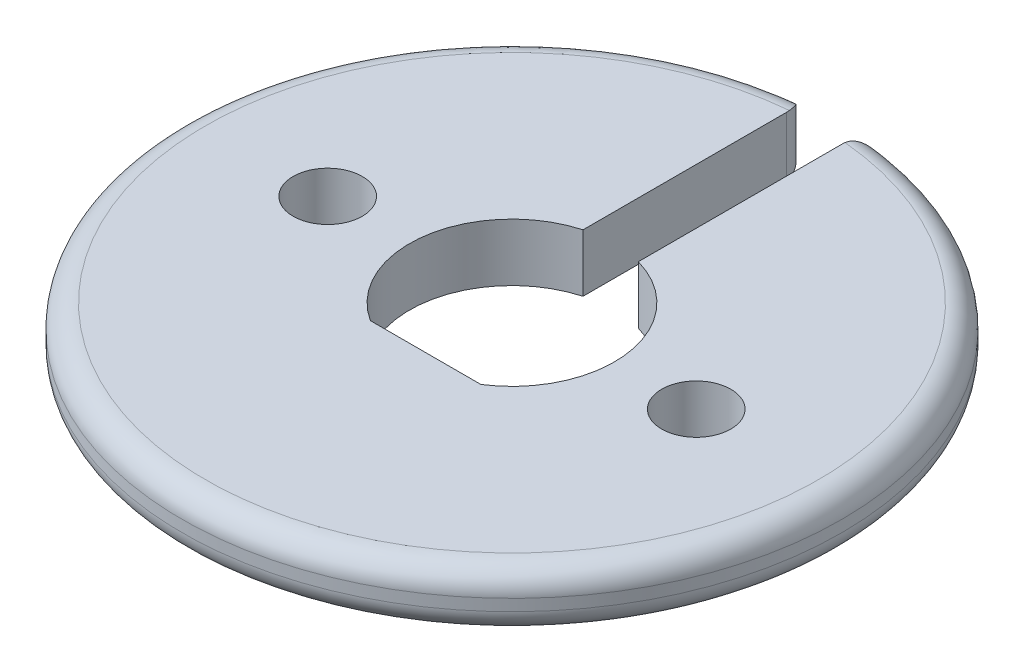
ISO-10303-21;
HEADER;
FILE_DESCRIPTION(('STEP AP214'),'2;1');
FILE_NAME('part.step','',(''),(''),'','','');
FILE_SCHEMA(('AUTOMOTIVE_DESIGN { 1 0 10303 214 1 1 1 1 }'));
ENDSEC;
DATA;
#1=APPLICATION_CONTEXT('core data for automotive mechanical design processes');
#2=APPLICATION_PROTOCOL_DEFINITION('international standard','automotive_design',2000,#1);
#3=PRODUCT_CONTEXT('',#1,'mechanical');
#4=PRODUCT('Part','Part','',(#3));
#5=PRODUCT_RELATED_PRODUCT_CATEGORY('part','',(#4));
#6=PRODUCT_DEFINITION_FORMATION('','',#4);
#7=PRODUCT_DEFINITION_CONTEXT('part definition',#1,'design');
#8=PRODUCT_DEFINITION('design','',#6,#7);
#9=PRODUCT_DEFINITION_SHAPE('','',#8);
#10=(LENGTH_UNIT() NAMED_UNIT(*) SI_UNIT(.MILLI.,.METRE.));
#11=(NAMED_UNIT(*) PLANE_ANGLE_UNIT() SI_UNIT($,.RADIAN.));
#12=(NAMED_UNIT(*) SI_UNIT($,.STERADIAN.) SOLID_ANGLE_UNIT());
#13=UNCERTAINTY_MEASURE_WITH_UNIT(LENGTH_MEASURE(1.E-05),#10,'distance_accuracy_value','');
#14=(GEOMETRIC_REPRESENTATION_CONTEXT(3) GLOBAL_UNCERTAINTY_ASSIGNED_CONTEXT((#13)) GLOBAL_UNIT_ASSIGNED_CONTEXT((#10,
#11,#12)) REPRESENTATION_CONTEXT('',''));
#15=CARTESIAN_POINT('',(0.,0.,0.));
#16=DIRECTION('',(0.,0.,1.));
#17=DIRECTION('',(1.,0.,0.));
#18=AXIS2_PLACEMENT_3D('',#15,#16,#17);
#19=CARTESIAN_POINT('',(0.,2.5,0.));
#20=DIRECTION('',(0.,-1.,0.));
#21=DIRECTION('',(0.,0.,-1.));
#22=AXIS2_PLACEMENT_3D('',#19,#20,#21);
#23=CYLINDRICAL_SURFACE('',#22,4.45);
#24=DIRECTION('',(0.,-1.,0.));
#25=VECTOR('',#24,1.);
#26=CARTESIAN_POINT('',(1.2,2.5,-4.28514877221317));
#27=LINE('',#26,#25);
#28=CARTESIAN_POINT('',(1.2,0.,-4.28514877221317));
#29=VERTEX_POINT('',#28);
#30=CARTESIAN_POINT('',(1.2,2.5,-4.28514877221317));
#31=VERTEX_POINT('',#30);
#32=EDGE_CURVE('E124',#29,#31,#27,.F.);
#33=ORIENTED_EDGE('',*,*,#32,.F.);
#34=CARTESIAN_POINT('',(0.,0.,0.));
#35=DIRECTION('',(0.,1.,0.));
#36=DIRECTION('',(0.,0.,1.));
#37=AXIS2_PLACEMENT_3D('',#34,#35,#36);
#38=CIRCLE('',#37,4.45);
#39=CARTESIAN_POINT('',(2.4,0.,3.74733238451035));
#40=VERTEX_POINT('',#39);
#41=EDGE_CURVE('E140',#40,#29,#38,.T.);
#42=ORIENTED_EDGE('',*,*,#41,.F.);
#43=DIRECTION('',(0.,-1.,0.));
#44=VECTOR('',#43,1.);
#45=CARTESIAN_POINT('',(2.4,2.5,3.74733238451035));
#46=LINE('',#45,#44);
#47=CARTESIAN_POINT('',(2.4,2.5,3.74733238451035));
#48=VERTEX_POINT('',#47);
#49=EDGE_CURVE('E153',#48,#40,#46,.T.);
#50=ORIENTED_EDGE('',*,*,#49,.F.);
#51=CARTESIAN_POINT('',(0.,2.5,0.));
#52=DIRECTION('',(0.,1.,0.));
#53=DIRECTION('',(0.,0.,1.));
#54=AXIS2_PLACEMENT_3D('',#51,#52,#53);
#55=CIRCLE('',#54,4.45);
#56=EDGE_CURVE('E229',#48,#31,#55,.T.);
#57=ORIENTED_EDGE('',*,*,#56,.T.);
#58=EDGE_LOOP('',(#33,#42,#50,#57));
#59=FACE_BOUND('',#58,.T.);
#60=ADVANCED_FACE('F38',(#59),#23,.F.);
#61=CARTESIAN_POINT('',(0.,2.5,0.));
#62=DIRECTION('',(0.,1.,0.));
#63=DIRECTION('',(0.,0.,1.));
#64=AXIS2_PLACEMENT_3D('',#61,#62,#63);
#65=PLANE('',#64);
#66=CARTESIAN_POINT('',(8.,2.5,2.82555433138731E-13));
#67=DIRECTION('',(0.,1.,0.));
#68=DIRECTION('',(0.,0.,1.));
#69=AXIS2_PLACEMENT_3D('',#66,#67,#68);
#70=CIRCLE('',#69,1.5);
#71=CARTESIAN_POINT('',(8.,2.5,1.50000000000028));
#72=VERTEX_POINT('',#71);
#73=EDGE_CURVE('E216',#72,#72,#70,.T.);
#74=ORIENTED_EDGE('',*,*,#73,.F.);
#75=EDGE_LOOP('',(#74));
#76=FACE_BOUND('',#75,.T.);
#77=CARTESIAN_POINT('',(-8.,2.5,2.86229373536173E-13));
#78=DIRECTION('',(0.,1.,0.));
#79=DIRECTION('',(0.,0.,1.));
#80=AXIS2_PLACEMENT_3D('',#77,#78,#79);
#81=CIRCLE('',#80,1.5);
#82=CARTESIAN_POINT('',(-8.,2.5,1.50000000000029));
#83=VERTEX_POINT('',#82);
#84=EDGE_CURVE('E221',#83,#83,#81,.T.);
#85=ORIENTED_EDGE('',*,*,#84,.F.);
#86=EDGE_LOOP('',(#85));
#87=FACE_BOUND('',#86,.T.);
#88=DIRECTION('',(0.,0.,1.));
#89=VECTOR('',#88,1.);
#90=CARTESIAN_POINT('',(-1.2,2.5,0.));
#91=LINE('',#90,#89);
#92=CARTESIAN_POINT('',(-1.2,2.5,-13.1245701078071));
#93=VERTEX_POINT('',#92);
#94=CARTESIAN_POINT('',(-1.2,2.5,-4.28514877221317));
#95=VERTEX_POINT('',#94);
#96=EDGE_CURVE('E120',#93,#95,#91,.T.);
#97=ORIENTED_EDGE('',*,*,#96,.F.);
#98=CARTESIAN_POINT('',(-2.2,2.5,-13.1245701078071));
#99=DIRECTION('',(0.,1.,0.));
#100=DIRECTION('',(0.,0.,1.));
#101=AXIS2_PLACEMENT_3D('',#98,#99,#100);
#102=CIRCLE('',#101,1.);
#103=CARTESIAN_POINT('',(-1.20824469118221,2.5,-13.2527161473026));
#104=VERTEX_POINT('',#103);
#105=EDGE_CURVE('E48',#93,#104,#102,.T.);
#106=ORIENTED_EDGE('',*,*,#105,.T.);
#107=CARTESIAN_POINT('',(0.,2.5,0.));
#108=DIRECTION('',(0.,1.,0.));
#109=DIRECTION('',(0.,0.,1.));
#110=AXIS2_PLACEMENT_3D('',#107,#108,#109);
#111=CIRCLE('',#110,13.3076797569954);
#112=CARTESIAN_POINT('',(1.20824469118221,2.5,-13.2527161473026));
#113=VERTEX_POINT('',#112);
#114=EDGE_CURVE('E59',#104,#113,#111,.T.);
#115=ORIENTED_EDGE('',*,*,#114,.T.);
#116=CARTESIAN_POINT('',(2.2,2.5,-13.1245701078071));
#117=DIRECTION('',(0.,1.,0.));
#118=DIRECTION('',(0.,0.,1.));
#119=AXIS2_PLACEMENT_3D('',#116,#117,#118);
#120=CIRCLE('',#119,1.);
#121=CARTESIAN_POINT('',(1.2,2.5,-13.1245701078071));
#122=VERTEX_POINT('',#121);
#123=EDGE_CURVE('E174',#113,#122,#120,.T.);
#124=ORIENTED_EDGE('',*,*,#123,.T.);
#125=DIRECTION('',(0.,0.,-1.));
#126=VECTOR('',#125,1.);
#127=CARTESIAN_POINT('',(1.2,2.5,0.));
#128=LINE('',#127,#126);
#129=EDGE_CURVE('E141',#31,#122,#128,.T.);
#130=ORIENTED_EDGE('',*,*,#129,.F.);
#131=ORIENTED_EDGE('',*,*,#56,.F.);
#132=DIRECTION('',(1.,0.,0.));
#133=VECTOR('',#132,1.);
#134=CARTESIAN_POINT('',(-2.4,2.5,3.74733238451035));
#135=LINE('',#134,#133);
#136=CARTESIAN_POINT('',(-2.4,2.5,3.74733238451035));
#137=VERTEX_POINT('',#136);
#138=EDGE_CURVE('E149',#137,#48,#135,.T.);
#139=ORIENTED_EDGE('',*,*,#138,.F.);
#140=EDGE_CURVE('E152',#95,#137,#55,.T.);
#141=ORIENTED_EDGE('',*,*,#140,.F.);
#142=EDGE_LOOP('',(#97,#106,#115,#124,#130,#131,#139,#141));
#143=FACE_BOUND('',#142,.T.);
#144=ADVANCED_FACE('F238',(#76,#87,#143),#65,.T.);
#145=CARTESIAN_POINT('',(0.,0.,0.));
#146=DIRECTION('',(0.,1.,0.));
#147=DIRECTION('',(0.,0.,1.));
#148=AXIS2_PLACEMENT_3D('',#145,#146,#147);
#149=PLANE('',#148);
#150=CARTESIAN_POINT('',(8.,0.,2.82555433138731E-13));
#151=DIRECTION('',(0.,1.,0.));
#152=DIRECTION('',(0.,0.,1.));
#153=AXIS2_PLACEMENT_3D('',#150,#151,#152);
#154=CIRCLE('',#153,1.5);
#155=CARTESIAN_POINT('',(8.,0.,1.50000000000028));
#156=VERTEX_POINT('',#155);
#157=EDGE_CURVE('E43',#156,#156,#154,.T.);
#158=ORIENTED_EDGE('',*,*,#157,.T.);
#159=EDGE_LOOP('',(#158));
#160=FACE_BOUND('',#159,.T.);
#161=CARTESIAN_POINT('',(-8.,0.,2.86229373536173E-13));
#162=DIRECTION('',(0.,1.,0.));
#163=DIRECTION('',(0.,0.,1.));
#164=AXIS2_PLACEMENT_3D('',#161,#162,#163);
#165=CIRCLE('',#164,1.5);
#166=CARTESIAN_POINT('',(-8.,0.,1.50000000000029));
#167=VERTEX_POINT('',#166);
#168=EDGE_CURVE('E214',#167,#167,#165,.T.);
#169=ORIENTED_EDGE('',*,*,#168,.T.);
#170=EDGE_LOOP('',(#169));
#171=FACE_BOUND('',#170,.T.);
#172=CARTESIAN_POINT('',(0.,0.,0.));
#173=DIRECTION('',(0.,1.,0.));
#174=DIRECTION('',(0.,0.,1.));
#175=AXIS2_PLACEMENT_3D('',#172,#173,#174);
#176=CIRCLE('',#175,13.3076797569954);
#177=CARTESIAN_POINT('',(1.20824469118221,0.,-13.2527161473026));
#178=VERTEX_POINT('',#177);
#179=CARTESIAN_POINT('',(-1.20824469118221,0.,-13.2527161473026));
#180=VERTEX_POINT('',#179);
#181=EDGE_CURVE('E167',#178,#180,#176,.F.);
#182=ORIENTED_EDGE('',*,*,#181,.T.);
#183=CARTESIAN_POINT('',(-2.2,0.,-13.1245701078071));
#184=DIRECTION('',(0.,1.,0.));
#185=DIRECTION('',(0.,0.,1.));
#186=AXIS2_PLACEMENT_3D('',#183,#184,#185);
#187=CIRCLE('',#186,1.);
#188=CARTESIAN_POINT('',(-1.2,0.,-13.1245701078071));
#189=VERTEX_POINT('',#188);
#190=EDGE_CURVE('E133',#180,#189,#187,.F.);
#191=ORIENTED_EDGE('',*,*,#190,.T.);
#192=DIRECTION('',(0.,0.,-1.));
#193=VECTOR('',#192,1.);
#194=CARTESIAN_POINT('',(-1.2,0.,-4.28514877221317));
#195=LINE('',#194,#193);
#196=CARTESIAN_POINT('',(-1.2,0.,-4.28514877221317));
#197=VERTEX_POINT('',#196);
#198=EDGE_CURVE('E118',#197,#189,#195,.T.);
#199=ORIENTED_EDGE('',*,*,#198,.F.);
#200=CARTESIAN_POINT('',(-2.4,0.,3.74733238451035));
#201=VERTEX_POINT('',#200);
#202=EDGE_CURVE('E130',#197,#201,#38,.T.);
#203=ORIENTED_EDGE('',*,*,#202,.T.);
#204=DIRECTION('',(1.,0.,0.));
#205=VECTOR('',#204,1.);
#206=CARTESIAN_POINT('',(-2.4,0.,3.74733238451035));
#207=LINE('',#206,#205);
#208=EDGE_CURVE('E144',#201,#40,#207,.T.);
#209=ORIENTED_EDGE('',*,*,#208,.T.);
#210=ORIENTED_EDGE('',*,*,#41,.T.);
#211=DIRECTION('',(0.,0.,1.));
#212=VECTOR('',#211,1.);
#213=CARTESIAN_POINT('',(1.2,0.,-4.28514877221317));
#214=LINE('',#213,#212);
#215=CARTESIAN_POINT('',(1.2,0.,-13.1245701078071));
#216=VERTEX_POINT('',#215);
#217=EDGE_CURVE('E134',#216,#29,#214,.T.);
#218=ORIENTED_EDGE('',*,*,#217,.F.);
#219=CARTESIAN_POINT('',(2.2,0.,-13.1245701078071));
#220=DIRECTION('',(0.,1.,0.));
#221=DIRECTION('',(0.,0.,1.));
#222=AXIS2_PLACEMENT_3D('',#219,#220,#221);
#223=CIRCLE('',#222,1.);
#224=EDGE_CURVE('E169',#216,#178,#223,.F.);
#225=ORIENTED_EDGE('',*,*,#224,.T.);
#226=EDGE_LOOP('',(#182,#191,#199,#203,#209,#210,#218,#225));
#227=FACE_BOUND('',#226,.T.);
#228=ADVANCED_FACE('F128',(#160,#171,#227),#149,.F.);
#229=CARTESIAN_POINT('',(0.,2.5,0.));
#230=DIRECTION('',(0.,-1.,0.));
#231=DIRECTION('',(0.,0.,-1.));
#232=AXIS2_PLACEMENT_3D('',#229,#230,#231);
#233=CYLINDRICAL_SURFACE('',#232,14.3076797569954);
#234=CARTESIAN_POINT('',(0.,1.5,0.));
#235=DIRECTION('',(0.,1.,0.));
#236=DIRECTION('',(0.,0.,1.));
#237=AXIS2_PLACEMENT_3D('',#234,#235,#236);
#238=CIRCLE('',#237,14.3076797569954);
#239=CARTESIAN_POINT('',(2.36531807498926,1.5,-14.1108104102091));
#240=VERTEX_POINT('',#239);
#241=CARTESIAN_POINT('',(-2.36531807498926,1.5,-14.1108104102091));
#242=VERTEX_POINT('',#241);
#243=EDGE_CURVE('E162',#240,#242,#238,.F.);
#244=ORIENTED_EDGE('',*,*,#243,.T.);
#245=DIRECTION('',(0.,-1.,0.));
#246=VECTOR('',#245,1.);
#247=CARTESIAN_POINT('',(-2.36531807498926,2.5,-14.1108104102091));
#248=LINE('',#247,#246);
#249=CARTESIAN_POINT('',(-2.36531807498926,1.,-14.1108104102091));
#250=VERTEX_POINT('',#249);
#251=EDGE_CURVE('E164',#242,#250,#248,.T.);
#252=ORIENTED_EDGE('',*,*,#251,.T.);
#253=CARTESIAN_POINT('',(0.,1.,0.));
#254=DIRECTION('',(0.,1.,0.));
#255=DIRECTION('',(0.,0.,1.));
#256=AXIS2_PLACEMENT_3D('',#253,#254,#255);
#257=CIRCLE('',#256,14.3076797569954);
#258=CARTESIAN_POINT('',(2.36531807498926,1.,-14.1108104102091));
#259=VERTEX_POINT('',#258);
#260=EDGE_CURVE('E158',#250,#259,#257,.T.);
#261=ORIENTED_EDGE('',*,*,#260,.T.);
#262=DIRECTION('',(0.,-1.,0.));
#263=VECTOR('',#262,1.);
#264=CARTESIAN_POINT('',(2.36531807498926,2.5,-14.1108104102091));
#265=LINE('',#264,#263);
#266=EDGE_CURVE('E160',#259,#240,#265,.F.);
#267=ORIENTED_EDGE('',*,*,#266,.T.);
#268=EDGE_LOOP('',(#244,#252,#261,#267));
#269=FACE_BOUND('',#268,.T.);
#270=ADVANCED_FACE('F261',(#269),#233,.T.);
#271=DIRECTION('',(0.,-1.,0.));
#272=VECTOR('',#271,1.);
#273=CARTESIAN_POINT('',(-1.2,2.5,-4.28514877221316));
#274=LINE('',#273,#272);
#275=EDGE_CURVE('E114',#95,#197,#274,.T.);
#276=ORIENTED_EDGE('',*,*,#275,.F.);
#277=ORIENTED_EDGE('',*,*,#140,.T.);
#278=DIRECTION('',(0.,-1.,0.));
#279=VECTOR('',#278,1.);
#280=CARTESIAN_POINT('',(-2.4,2.5,3.74733238451035));
#281=LINE('',#280,#279);
#282=EDGE_CURVE('E125',#137,#201,#281,.T.);
#283=ORIENTED_EDGE('',*,*,#282,.T.);
#284=ORIENTED_EDGE('',*,*,#202,.F.);
#285=EDGE_LOOP('',(#276,#277,#283,#284));
#286=FACE_BOUND('',#285,.T.);
#287=ADVANCED_FACE('F138',(#286),#23,.F.);
#288=CARTESIAN_POINT('',(-2.4,2.5,3.74733238451035));
#289=DIRECTION('',(0.,0.,-1.));
#290=DIRECTION('',(-1.,0.,0.));
#291=AXIS2_PLACEMENT_3D('',#288,#289,#290);
#292=PLANE('',#291);
#293=ORIENTED_EDGE('',*,*,#208,.F.);
#294=ORIENTED_EDGE('',*,*,#282,.F.);
#295=ORIENTED_EDGE('',*,*,#138,.T.);
#296=ORIENTED_EDGE('',*,*,#49,.T.);
#297=EDGE_LOOP('',(#293,#294,#295,#296));
#298=FACE_BOUND('',#297,.T.);
#299=ADVANCED_FACE('F237',(#298),#292,.T.);
#300=CARTESIAN_POINT('',(-1.2,15.,-4.28514877221317));
#301=DIRECTION('',(-1.,0.,0.));
#302=DIRECTION('',(0.,0.,1.));
#303=AXIS2_PLACEMENT_3D('',#300,#301,#302);
#304=PLANE('',#303);
#305=ORIENTED_EDGE('',*,*,#198,.T.);
#306=DIRECTION('',(0.,-1.,0.));
#307=VECTOR('',#306,1.);
#308=CARTESIAN_POINT('',(-1.2,15.,-13.1245701078071));
#309=LINE('',#308,#307);
#310=EDGE_CURVE('E172',#189,#93,#309,.F.);
#311=ORIENTED_EDGE('',*,*,#310,.T.);
#312=ORIENTED_EDGE('',*,*,#96,.T.);
#313=ORIENTED_EDGE('',*,*,#275,.T.);
#314=EDGE_LOOP('',(#305,#311,#312,#313));
#315=FACE_BOUND('',#314,.T.);
#316=ADVANCED_FACE('F116',(#315),#304,.F.);
#317=CARTESIAN_POINT('',(1.2,15.,-4.28514877221317));
#318=DIRECTION('',(1.,0.,0.));
#319=DIRECTION('',(0.,0.,-1.));
#320=AXIS2_PLACEMENT_3D('',#317,#318,#319);
#321=PLANE('',#320);
#322=ORIENTED_EDGE('',*,*,#129,.T.);
#323=DIRECTION('',(0.,-1.,0.));
#324=VECTOR('',#323,1.);
#325=CARTESIAN_POINT('',(1.2,15.,-13.1245701078071));
#326=LINE('',#325,#324);
#327=EDGE_CURVE('E11',#122,#216,#326,.T.);
#328=ORIENTED_EDGE('',*,*,#327,.T.);
#329=ORIENTED_EDGE('',*,*,#217,.T.);
#330=ORIENTED_EDGE('',*,*,#32,.T.);
#331=EDGE_LOOP('',(#322,#328,#329,#330));
#332=FACE_BOUND('',#331,.T.);
#333=ADVANCED_FACE('F242',(#332),#321,.F.);
#334=CARTESIAN_POINT('',(2.2,2.5,-13.1245701078071));
#335=DIRECTION('',(0.,-1.,0.));
#336=DIRECTION('',(0.,0.,-1.));
#337=AXIS2_PLACEMENT_3D('',#334,#335,#336);
#338=CYLINDRICAL_SURFACE('',#337,1.);
#339=ORIENTED_EDGE('',*,*,#327,.F.);
#340=ORIENTED_EDGE('',*,*,#123,.F.);
#341=CARTESIAN_POINT('',(1.20824469118221,2.5,-13.2527161473026));
#342=CARTESIAN_POINT('',(1.21114076883326,2.50000302749352,-13.2751538099801));
#343=CARTESIAN_POINT('',(1.21480316606462,2.49923271086172,-13.2974776019075));
#344=CARTESIAN_POINT('',(1.22359985534397,2.49619265950357,-13.3417104254906));
#345=CARTESIAN_POINT('',(1.22873289413298,2.49392419933384,-13.3636197934367));
#346=CARTESIAN_POINT('',(1.24614624906345,2.48499684543939,-13.428095389917));
#347=CARTESIAN_POINT('',(1.26049779688794,2.47621402251305,-13.4698381384406));
#348=CARTESIAN_POINT('',(1.29386212416004,2.45372722301437,-13.5497647147368));
#349=CARTESIAN_POINT('',(1.3128606318785,2.4400382553919,-13.5879589542471));
#350=CARTESIAN_POINT('',(1.35466817796591,2.40857063781181,-13.6604527913556));
#351=CARTESIAN_POINT('',(1.37748605545544,2.39078246428018,-13.6947430373399));
#352=CARTESIAN_POINT('',(1.43591909924738,2.34406565831597,-13.772175531894));
#353=CARTESIAN_POINT('',(1.47297208220996,2.31354421577944,-13.8132704595732));
#354=CARTESIAN_POINT('',(1.55098298163015,2.24792367873468,-13.8872485379661));
#355=CARTESIAN_POINT('',(1.59194761406703,2.21281667175706,-13.9201172014672));
#356=CARTESIAN_POINT('',(1.69137158297301,2.12635818789753,-13.9883462474609));
#357=CARTESIAN_POINT('',(1.75088430112311,2.07366029364755,-14.0204585107733));
#358=CARTESIAN_POINT('',(1.87214460133287,1.96465390897243,-14.0715913422367));
#359=CARTESIAN_POINT('',(1.93389499943724,1.90834079496376,-14.0905947653418));
#360=CARTESIAN_POINT('',(2.05703854524244,1.79449981471324,-14.1162649216869));
#361=CARTESIAN_POINT('',(2.11842364374554,1.7370018895979,-14.1231085511498));
#362=CARTESIAN_POINT('',(2.24041237754055,1.62116603681527,-14.1256080098269));
#363=CARTESIAN_POINT('',(2.30101743262824,1.56283023048996,-14.1212883684982));
#364=CARTESIAN_POINT('',(2.36221391471458,1.50303488331201,-14.1113269755772));
#365=CARTESIAN_POINT('',(2.36376632650878,1.50151741724244,-14.1110705182664));
#366=CARTESIAN_POINT('',(2.36531807498926,1.5,-14.1108104102091));
#367=B_SPLINE_CURVE_WITH_KNOTS('',3,(#341,#342,#343,#344,#345,#346,#347,#348,#349,#350,#351,
#352,#353,#354,#355,#356,#357,#358,#359,#360,#361,#362,#363,#364,#365,#366),.UNSPECIFIED.,.F.,
.F.,(4,2,2,2,2,2,2,2,2,2,2,2,4),(0.,0.0678176525582379,0.135577682946539,0.269819827372759,
0.403654753390087,0.537803806403003,0.726339360318439,0.915204642727735,1.17103011224785,
1.42718954459645,1.67959097262058,1.93143826169331,1.93799615062952),.UNSPECIFIED.);
#368=EDGE_CURVE('E135',#240,#113,#367,.F.);
#369=ORIENTED_EDGE('',*,*,#368,.F.);
#370=ORIENTED_EDGE('',*,*,#266,.F.);
#371=CARTESIAN_POINT('',(1.20824469118221,0.,-13.2527161473026));
#372=CARTESIAN_POINT('',(1.21114076883326,-3.02749351678232E-06,-13.2751538099801));
#373=CARTESIAN_POINT('',(1.21480316606462,0.000767289138279008,-13.2974776019075));
#374=CARTESIAN_POINT('',(1.22359985534397,0.00380734049643373,-13.3417104254906));
#375=CARTESIAN_POINT('',(1.22873289413298,0.00607580066616507,-13.3636197934367));
#376=CARTESIAN_POINT('',(1.24614624906345,0.0150031545606109,-13.428095389917));
#377=CARTESIAN_POINT('',(1.26049779688794,0.0237859774869519,-13.4698381384406));
#378=CARTESIAN_POINT('',(1.29386212416004,0.04627277698563,-13.5497647147368));
#379=CARTESIAN_POINT('',(1.3128606318785,0.0599617446080982,-13.5879589542471));
#380=CARTESIAN_POINT('',(1.35466817796591,0.0914293621881873,-13.6604527913556));
#381=CARTESIAN_POINT('',(1.37748605545544,0.109217535719816,-13.6947430373399));
#382=CARTESIAN_POINT('',(1.43591909924738,0.155934341684033,-13.772175531894));
#383=CARTESIAN_POINT('',(1.47297208220996,0.186455784220558,-13.8132704595732));
#384=CARTESIAN_POINT('',(1.55098298163015,0.252076321265316,-13.8872485379661));
#385=CARTESIAN_POINT('',(1.59194761406703,0.287183328242944,-13.9201172014672));
#386=CARTESIAN_POINT('',(1.69137158297301,0.373641812102465,-13.9883462474609));
#387=CARTESIAN_POINT('',(1.75088430112311,0.426339706352453,-14.0204585107733));
#388=CARTESIAN_POINT('',(1.87214460133287,0.535346091027573,-14.0715913422367));
#389=CARTESIAN_POINT('',(1.93389499943724,0.591659205036238,-14.0905947653418));
#390=CARTESIAN_POINT('',(2.05703854524244,0.705500185286764,-14.1162649216869));
#391=CARTESIAN_POINT('',(2.11842364374554,0.762998110402102,-14.1231085511498));
#392=CARTESIAN_POINT('',(2.24041237754055,0.878833963184728,-14.1256080098269));
#393=CARTESIAN_POINT('',(2.30101743262824,0.937169769510039,-14.1212883684982));
#394=CARTESIAN_POINT('',(2.36221391471458,0.996965116687993,-14.1113269755772));
#395=CARTESIAN_POINT('',(2.36376632650878,0.998482582757559,-14.1110705182664));
#396=CARTESIAN_POINT('',(2.36531807498926,1.,-14.1108104102091));
#397=B_SPLINE_CURVE_WITH_KNOTS('',3,(#371,#372,#373,#374,#375,#376,#377,#378,#379,#380,#381,
#382,#383,#384,#385,#386,#387,#388,#389,#390,#391,#392,#393,#394,#395,#396),.UNSPECIFIED.,.F.,
.F.,(4,2,2,2,2,2,2,2,2,2,2,2,4),(0.,0.0678176525582414,0.135577682946539,0.269819827372759,
0.403654753390087,0.537803806403003,0.726339360318438,0.915204642727735,1.17103011224785,
1.42718954459645,1.67959097262058,1.9314382616933,1.93799615062952),.UNSPECIFIED.);
#398=EDGE_CURVE('E202',#178,#259,#397,.T.);
#399=ORIENTED_EDGE('',*,*,#398,.F.);
#400=ORIENTED_EDGE('',*,*,#224,.F.);
#401=EDGE_LOOP('',(#339,#340,#369,#370,#399,#400));
#402=FACE_BOUND('',#401,.T.);
#403=ADVANCED_FACE('F40',(#402),#338,.T.);
#404=CARTESIAN_POINT('',(0.,1.5,0.));
#405=DIRECTION('',(0.,1.,0.));
#406=DIRECTION('',(0.,0.,1.));
#407=AXIS2_PLACEMENT_3D('',#404,#405,#406);
#408=TOROIDAL_SURFACE('',#407,13.3076797569954,1.);
#409=ORIENTED_EDGE('',*,*,#368,.T.);
#410=ORIENTED_EDGE('',*,*,#114,.F.);
#411=CARTESIAN_POINT('',(-1.20824469118221,2.5,-13.2527161473026));
#412=CARTESIAN_POINT('',(-1.21114076883325,2.50000302749352,-13.2751538099801));
#413=CARTESIAN_POINT('',(-1.21480316606461,2.49923271086172,-13.2974776019075));
#414=CARTESIAN_POINT('',(-1.22359985534397,2.49619265950357,-13.3417104254906));
#415=CARTESIAN_POINT('',(-1.22873289413298,2.49392419933384,-13.3636197934367));
#416=CARTESIAN_POINT('',(-1.24614624906345,2.48499684543939,-13.428095389917));
#417=CARTESIAN_POINT('',(-1.26049779688794,2.47621402251305,-13.4698381384406));
#418=CARTESIAN_POINT('',(-1.29386212416004,2.45372722301437,-13.5497647147368));
#419=CARTESIAN_POINT('',(-1.31286063187849,2.4400382553919,-13.5879589542471));
#420=CARTESIAN_POINT('',(-1.35466817796591,2.40857063781181,-13.6604527913556));
#421=CARTESIAN_POINT('',(-1.37748605545544,2.39078246428018,-13.6947430373399));
#422=CARTESIAN_POINT('',(-1.43591909924738,2.34406565831597,-13.772175531894));
#423=CARTESIAN_POINT('',(-1.47297208220996,2.31354421577944,-13.8132704595732));
#424=CARTESIAN_POINT('',(-1.55098298163015,2.24792367873469,-13.8872485379661));
#425=CARTESIAN_POINT('',(-1.59194761406704,2.21281667175707,-13.9201172014672));
#426=CARTESIAN_POINT('',(-1.691371582973,2.12635818789752,-13.9883462474609));
#427=CARTESIAN_POINT('',(-1.75088430112307,2.0736602936475,-14.0204585107733));
#428=CARTESIAN_POINT('',(-1.87214460133292,1.96465390897248,-14.0715913422367));
#429=CARTESIAN_POINT('',(-1.93389499943741,1.90834079496395,-14.0905947653418));
#430=CARTESIAN_POINT('',(-2.05703854524227,1.79449981471306,-14.1162649216869));
#431=CARTESIAN_POINT('',(-2.1184236437449,1.73700188959723,-14.1231085511499));
#432=CARTESIAN_POINT('',(-2.2404123775412,1.62116603681596,-14.1256080098268));
#433=CARTESIAN_POINT('',(-2.30101743263064,1.56283023049249,-14.1212883684978));
#434=CARTESIAN_POINT('',(-2.3622139147147,1.50303488331214,-14.1113269755772));
#435=CARTESIAN_POINT('',(-2.36376632650884,1.50151741724251,-14.1110705182663));
#436=CARTESIAN_POINT('',(-2.36531807498926,1.5,-14.1108104102091));
#437=B_SPLINE_CURVE_WITH_KNOTS('',3,(#411,#412,#413,#414,#415,#416,#417,#418,#419,#420,#421,
#422,#423,#424,#425,#426,#427,#428,#429,#430,#431,#432,#433,#434,#435,#436),.UNSPECIFIED.,.F.,
.F.,(4,2,2,2,2,2,2,2,2,2,2,2,4),(0.,0.0678176525582396,0.135577682946537,0.269819827372757,
0.403654753390085,0.537803806403001,0.726339360318435,0.915204642727733,1.17103011224786,
1.42718954459645,1.67959097262057,1.9314382616933,1.93799615062952),.UNSPECIFIED.);
#438=EDGE_CURVE('E186',#242,#104,#437,.F.);
#439=ORIENTED_EDGE('',*,*,#438,.F.);
#440=ORIENTED_EDGE('',*,*,#243,.F.);
#441=EDGE_LOOP('',(#409,#410,#439,#440));
#442=FACE_BOUND('',#441,.T.);
#443=ADVANCED_FACE('F198',(#442),#408,.T.);
#444=CARTESIAN_POINT('',(0.,1.,0.));
#445=DIRECTION('',(0.,1.,0.));
#446=DIRECTION('',(0.,0.,1.));
#447=AXIS2_PLACEMENT_3D('',#444,#445,#446);
#448=TOROIDAL_SURFACE('',#447,13.3076797569954,1.);
#449=ORIENTED_EDGE('',*,*,#398,.T.);
#450=ORIENTED_EDGE('',*,*,#260,.F.);
#451=CARTESIAN_POINT('',(-1.20824469118221,0.,-13.2527161473026));
#452=CARTESIAN_POINT('',(-1.21114076883325,-3.02749351666357E-06,-13.2751538099801));
#453=CARTESIAN_POINT('',(-1.21480316606461,0.000767289138279027,-13.2974776019075));
#454=CARTESIAN_POINT('',(-1.22359985534397,0.00380734049643343,-13.3417104254906));
#455=CARTESIAN_POINT('',(-1.22873289413298,0.00607580066616468,-13.3636197934367));
#456=CARTESIAN_POINT('',(-1.24614624906345,0.0150031545606104,-13.428095389917));
#457=CARTESIAN_POINT('',(-1.26049779688794,0.0237859774869514,-13.4698381384406));
#458=CARTESIAN_POINT('',(-1.29386212416004,0.0462727769856298,-13.5497647147368));
#459=CARTESIAN_POINT('',(-1.31286063187849,0.0599617446080982,-13.5879589542471));
#460=CARTESIAN_POINT('',(-1.35466817796591,0.0914293621881871,-13.6604527913556));
#461=CARTESIAN_POINT('',(-1.37748605545544,0.109217535719816,-13.6947430373399));
#462=CARTESIAN_POINT('',(-1.43591909924738,0.155934341684032,-13.772175531894));
#463=CARTESIAN_POINT('',(-1.47297208220996,0.186455784220558,-13.8132704595732));
#464=CARTESIAN_POINT('',(-1.55098298163015,0.252076321265311,-13.8872485379661));
#465=CARTESIAN_POINT('',(-1.59194761406704,0.287183328242935,-13.9201172014672));
#466=CARTESIAN_POINT('',(-1.691371582973,0.373641812102478,-13.9883462474609));
#467=CARTESIAN_POINT('',(-1.75088430112307,0.426339706352503,-14.0204585107733));
#468=CARTESIAN_POINT('',(-1.87214460133292,0.535346091027524,-14.0715913422367));
#469=CARTESIAN_POINT('',(-1.93389499943741,0.591659205036052,-14.0905947653418));
#470=CARTESIAN_POINT('',(-2.05703854524227,0.70550018528694,-14.1162649216869));
#471=CARTESIAN_POINT('',(-2.1184236437449,0.762998110402768,-14.1231085511499));
#472=CARTESIAN_POINT('',(-2.2404123775412,0.87883396318404,-14.1256080098268));
#473=CARTESIAN_POINT('',(-2.30101743263064,0.937169769507511,-14.1212883684978));
#474=CARTESIAN_POINT('',(-2.3622139147147,0.996965116687863,-14.1113269755772));
#475=CARTESIAN_POINT('',(-2.36376632650884,0.998482582757492,-14.1110705182663));
#476=CARTESIAN_POINT('',(-2.36531807498926,1.,-14.1108104102091));
#477=B_SPLINE_CURVE_WITH_KNOTS('',3,(#451,#452,#453,#454,#455,#456,#457,#458,#459,#460,#461,
#462,#463,#464,#465,#466,#467,#468,#469,#470,#471,#472,#473,#474,#475,#476),.UNSPECIFIED.,.F.,
.F.,(4,2,2,2,2,2,2,2,2,2,2,2,4),(0.,0.0678176525582379,0.135577682946537,0.269819827372757,
0.403654753390087,0.537803806403001,0.726339360318435,0.915204642727733,1.17103011224786,
1.42718954459645,1.67959097262057,1.9314382616933,1.93799615062952),.UNSPECIFIED.);
#478=EDGE_CURVE('E178',#180,#250,#477,.T.);
#479=ORIENTED_EDGE('',*,*,#478,.F.);
#480=ORIENTED_EDGE('',*,*,#181,.F.);
#481=EDGE_LOOP('',(#449,#450,#479,#480));
#482=FACE_BOUND('',#481,.T.);
#483=ADVANCED_FACE('F195',(#482),#448,.T.);
#484=CARTESIAN_POINT('',(-2.2,2.5,-13.1245701078071));
#485=DIRECTION('',(0.,-1.,0.));
#486=DIRECTION('',(0.,0.,-1.));
#487=AXIS2_PLACEMENT_3D('',#484,#485,#486);
#488=CYLINDRICAL_SURFACE('',#487,1.);
#489=ORIENTED_EDGE('',*,*,#105,.F.);
#490=ORIENTED_EDGE('',*,*,#310,.F.);
#491=ORIENTED_EDGE('',*,*,#190,.F.);
#492=ORIENTED_EDGE('',*,*,#478,.T.);
#493=ORIENTED_EDGE('',*,*,#251,.F.);
#494=ORIENTED_EDGE('',*,*,#438,.T.);
#495=EDGE_LOOP('',(#489,#490,#491,#492,#493,#494));
#496=FACE_BOUND('',#495,.T.);
#497=ADVANCED_FACE('F192',(#496),#488,.T.);
#498=CARTESIAN_POINT('',(-8.,-7.5,2.86229373536173E-13));
#499=DIRECTION('',(0.,1.,0.));
#500=DIRECTION('',(0.,0.,1.));
#501=AXIS2_PLACEMENT_3D('',#498,#499,#500);
#502=CYLINDRICAL_SURFACE('',#501,1.5);
#503=ORIENTED_EDGE('',*,*,#84,.T.);
#504=EDGE_LOOP('',(#503));
#505=FACE_BOUND('',#504,.T.);
#506=ORIENTED_EDGE('',*,*,#168,.F.);
#507=EDGE_LOOP('',(#506));
#508=FACE_BOUND('',#507,.T.);
#509=ADVANCED_FACE('F281',(#505,#508),#502,.F.);
#510=CARTESIAN_POINT('',(8.,-7.5,2.82555433138731E-13));
#511=DIRECTION('',(0.,1.,0.));
#512=DIRECTION('',(0.,0.,1.));
#513=AXIS2_PLACEMENT_3D('',#510,#511,#512);
#514=CYLINDRICAL_SURFACE('',#513,1.5);
#515=ORIENTED_EDGE('',*,*,#73,.T.);
#516=EDGE_LOOP('',(#515));
#517=FACE_BOUND('',#516,.T.);
#518=ORIENTED_EDGE('',*,*,#157,.F.);
#519=EDGE_LOOP('',(#518));
#520=FACE_BOUND('',#519,.T.);
#521=ADVANCED_FACE('F285',(#517,#520),#514,.F.);
#522=CLOSED_SHELL('',(#60,#144,#228,#270,#287,#299,#316,#333,#403,#443,#483,#497,#509,#521));
#523=MANIFOLD_SOLID_BREP('B2',#522);
#524=ADVANCED_BREP_SHAPE_REPRESENTATION('',(#18,#523),#14);
#525=SHAPE_DEFINITION_REPRESENTATION(#9,#524);
ENDSEC;
END-ISO-10303-21;
